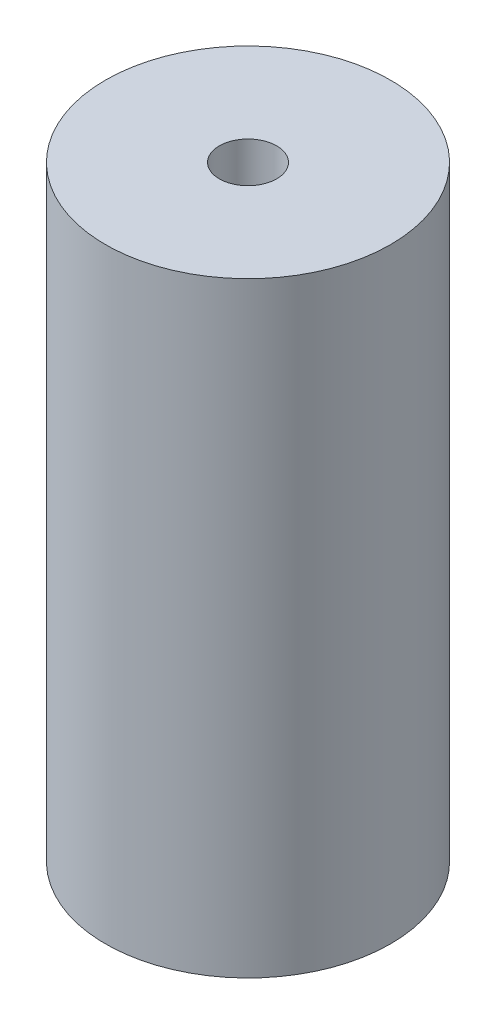
ISO-10303-21;
HEADER;
FILE_DESCRIPTION(('STEP AP214'),'2;1');
FILE_NAME('part.step','',(''),(''),'','','');
FILE_SCHEMA(('AUTOMOTIVE_DESIGN { 1 0 10303 214 1 1 1 1 }'));
ENDSEC;
DATA;
#1=APPLICATION_CONTEXT('core data for automotive mechanical design processes');
#2=APPLICATION_PROTOCOL_DEFINITION('international standard','automotive_design',2000,#1);
#3=PRODUCT_CONTEXT('',#1,'mechanical');
#4=PRODUCT('Part','Part','',(#3));
#5=PRODUCT_RELATED_PRODUCT_CATEGORY('part','',(#4));
#6=PRODUCT_DEFINITION_FORMATION('','',#4);
#7=PRODUCT_DEFINITION_CONTEXT('part definition',#1,'design');
#8=PRODUCT_DEFINITION('design','',#6,#7);
#9=PRODUCT_DEFINITION_SHAPE('','',#8);
#10=(LENGTH_UNIT() NAMED_UNIT(*) SI_UNIT(.MILLI.,.METRE.));
#11=(NAMED_UNIT(*) PLANE_ANGLE_UNIT() SI_UNIT($,.RADIAN.));
#12=(NAMED_UNIT(*) SI_UNIT($,.STERADIAN.) SOLID_ANGLE_UNIT());
#13=UNCERTAINTY_MEASURE_WITH_UNIT(LENGTH_MEASURE(1.E-05),#10,'distance_accuracy_value','');
#14=(GEOMETRIC_REPRESENTATION_CONTEXT(3) GLOBAL_UNCERTAINTY_ASSIGNED_CONTEXT((#13)) GLOBAL_UNIT_ASSIGNED_CONTEXT((#10,
#11,#12)) REPRESENTATION_CONTEXT('',''));
#15=CARTESIAN_POINT('',(0.,0.,0.));
#16=DIRECTION('',(0.,0.,1.));
#17=DIRECTION('',(1.,0.,0.));
#18=AXIS2_PLACEMENT_3D('',#15,#16,#17);
#19=CARTESIAN_POINT('',(412.75,26.035,-2231.7202));
#20=DIRECTION('',(0.,1.,0.));
#21=DIRECTION('',(0.,0.,-1.));
#22=AXIS2_PLACEMENT_3D('',#19,#20,#21);
#23=PLANE('',#22);
#24=CARTESIAN_POINT('',(412.75,26.035,-2231.7202));
#25=DIRECTION('',(0.,1.,0.));
#26=DIRECTION('',(1.,0.,0.));
#27=AXIS2_PLACEMENT_3D('',#24,#25,#26);
#28=CIRCLE('',#27,2.5527);
#29=CARTESIAN_POINT('',(410.1973,26.035,-2231.7202));
#30=VERTEX_POINT('',#29);
#31=EDGE_CURVE('E54',#30,#30,#28,.T.);
#32=ORIENTED_EDGE('',*,*,#31,.T.);
#33=EDGE_LOOP('',(#32));
#34=FACE_BOUND('',#33,.T.);
#35=CARTESIAN_POINT('',(412.75,26.035,-2231.7202));
#36=DIRECTION('',(0.,-1.,0.));
#37=DIRECTION('',(1.,0.,0.));
#38=AXIS2_PLACEMENT_3D('',#35,#36,#37);
#39=CIRCLE('',#38,12.7);
#40=CARTESIAN_POINT('',(400.05,26.035,-2231.7202));
#41=VERTEX_POINT('',#40);
#42=EDGE_CURVE('E68',#41,#41,#39,.T.);
#43=ORIENTED_EDGE('',*,*,#42,.T.);
#44=EDGE_LOOP('',(#43));
#45=FACE_BOUND('',#44,.T.);
#46=ADVANCED_FACE('F16',(#34,#45),#23,.F.);
#47=CARTESIAN_POINT('',(412.75,79.9973,-2231.7202));
#48=DIRECTION('',(0.,-1.,0.));
#49=DIRECTION('',(0.,0.,-1.));
#50=AXIS2_PLACEMENT_3D('',#47,#48,#49);
#51=PLANE('',#50);
#52=CARTESIAN_POINT('',(412.75,79.9973,-2231.7202));
#53=DIRECTION('',(0.,1.,0.));
#54=DIRECTION('',(1.,0.,0.));
#55=AXIS2_PLACEMENT_3D('',#52,#53,#54);
#56=CIRCLE('',#55,2.5527);
#57=CARTESIAN_POINT('',(410.1973,79.9973,-2231.7202));
#58=VERTEX_POINT('',#57);
#59=EDGE_CURVE('E56',#58,#58,#56,.T.);
#60=ORIENTED_EDGE('',*,*,#59,.F.);
#61=EDGE_LOOP('',(#60));
#62=FACE_BOUND('',#61,.T.);
#63=CARTESIAN_POINT('',(412.75,79.9973,-2231.7202));
#64=DIRECTION('',(0.,-1.,0.));
#65=DIRECTION('',(1.,0.,0.));
#66=AXIS2_PLACEMENT_3D('',#63,#64,#65);
#67=CIRCLE('',#66,12.7);
#68=CARTESIAN_POINT('',(400.05,79.9973,-2231.7202));
#69=VERTEX_POINT('',#68);
#70=EDGE_CURVE('E10',#69,#69,#67,.T.);
#71=ORIENTED_EDGE('',*,*,#70,.F.);
#72=EDGE_LOOP('',(#71));
#73=FACE_BOUND('',#72,.T.);
#74=ADVANCED_FACE('F76',(#62,#73),#51,.F.);
#75=CARTESIAN_POINT('',(412.75,79.9973,-2231.7202));
#76=DIRECTION('',(0.,-1.,0.));
#77=DIRECTION('',(1.,0.,0.));
#78=AXIS2_PLACEMENT_3D('',#75,#76,#77);
#79=CYLINDRICAL_SURFACE('',#78,12.7);
#80=ORIENTED_EDGE('',*,*,#42,.F.);
#81=DIRECTION('',(0.,1.,0.));
#82=VECTOR('',#81,1.);
#83=CARTESIAN_POINT('',(400.05,79.9973,-2231.7202));
#84=LINE('',#83,#82);
#85=EDGE_CURVE('E26',#41,#69,#84,.T.);
#86=ORIENTED_EDGE('',*,*,#85,.T.);
#87=ORIENTED_EDGE('',*,*,#70,.T.);
#88=ORIENTED_EDGE('',*,*,#85,.F.);
#89=EDGE_LOOP('',(#80,#86,#87,#88));
#90=FACE_BOUND('',#89,.T.);
#91=ADVANCED_FACE('F74',(#90),#79,.T.);
#92=CARTESIAN_POINT('',(412.75,79.9973,-2231.7202));
#93=DIRECTION('',(0.,-1.,0.));
#94=DIRECTION('',(1.,0.,0.));
#95=AXIS2_PLACEMENT_3D('',#92,#93,#94);
#96=CYLINDRICAL_SURFACE('',#95,2.5527);
#97=ORIENTED_EDGE('',*,*,#31,.F.);
#98=DIRECTION('',(0.,1.,0.));
#99=VECTOR('',#98,1.);
#100=CARTESIAN_POINT('',(410.1973,79.9973,-2231.7202));
#101=LINE('',#100,#99);
#102=EDGE_CURVE('E20',#30,#58,#101,.T.);
#103=ORIENTED_EDGE('',*,*,#102,.T.);
#104=ORIENTED_EDGE('',*,*,#59,.T.);
#105=ORIENTED_EDGE('',*,*,#102,.F.);
#106=EDGE_LOOP('',(#97,#103,#104,#105));
#107=FACE_BOUND('',#106,.T.);
#108=ADVANCED_FACE('F18',(#107),#96,.F.);
#109=CLOSED_SHELL('',(#46,#74,#91,#108));
#110=MANIFOLD_SOLID_BREP('B1',#109);
#111=ADVANCED_BREP_SHAPE_REPRESENTATION('',(#18,#110),#14);
#112=SHAPE_DEFINITION_REPRESENTATION(#9,#111);
ENDSEC;
END-ISO-10303-21;
